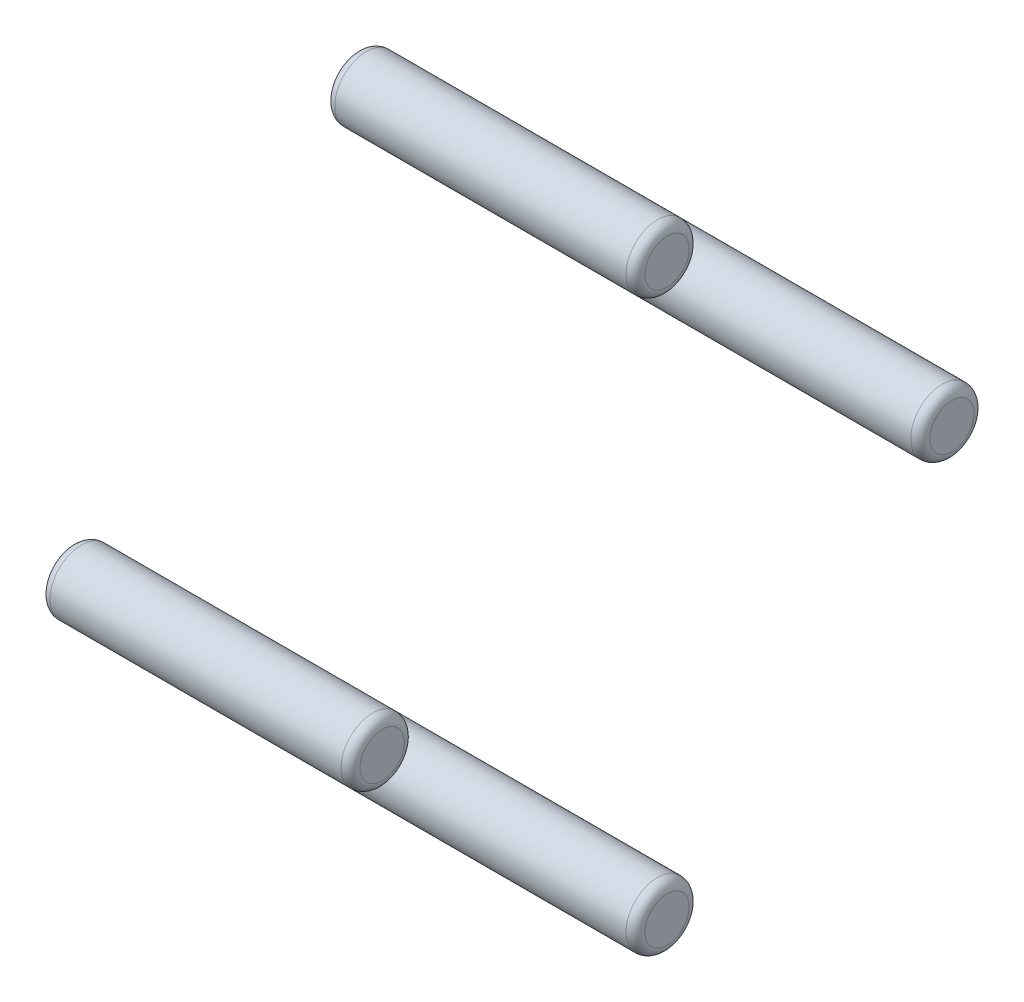
ISO-10303-21;
HEADER;
FILE_DESCRIPTION(('STEP AP214'),'2;1');
FILE_NAME('part.step','',(''),(''),'','','');
FILE_SCHEMA(('AUTOMOTIVE_DESIGN { 1 0 10303 214 1 1 1 1 }'));
ENDSEC;
DATA;
#1=APPLICATION_CONTEXT('core data for automotive mechanical design processes');
#2=APPLICATION_PROTOCOL_DEFINITION('international standard','automotive_design',2000,#1);
#3=PRODUCT_CONTEXT('',#1,'mechanical');
#4=PRODUCT('Part','Part','',(#3));
#5=PRODUCT_RELATED_PRODUCT_CATEGORY('part','',(#4));
#6=PRODUCT_DEFINITION_FORMATION('','',#4);
#7=PRODUCT_DEFINITION_CONTEXT('part definition',#1,'design');
#8=PRODUCT_DEFINITION('design','',#6,#7);
#9=PRODUCT_DEFINITION_SHAPE('','',#8);
#10=(LENGTH_UNIT() NAMED_UNIT(*) SI_UNIT(.MILLI.,.METRE.));
#11=(NAMED_UNIT(*) PLANE_ANGLE_UNIT() SI_UNIT($,.RADIAN.));
#12=(NAMED_UNIT(*) SI_UNIT($,.STERADIAN.) SOLID_ANGLE_UNIT());
#13=UNCERTAINTY_MEASURE_WITH_UNIT(LENGTH_MEASURE(1.E-05),#10,'distance_accuracy_value','');
#14=(GEOMETRIC_REPRESENTATION_CONTEXT(3) GLOBAL_UNCERTAINTY_ASSIGNED_CONTEXT((#13)) GLOBAL_UNIT_ASSIGNED_CONTEXT((#10,
#11,#12)) REPRESENTATION_CONTEXT('',''));
#15=CARTESIAN_POINT('',(0.,0.,0.));
#16=DIRECTION('',(0.,0.,1.));
#17=DIRECTION('',(1.,0.,0.));
#18=AXIS2_PLACEMENT_3D('',#15,#16,#17);
#19=CARTESIAN_POINT('',(1.59999999999999,0.,-9.35));
#20=DIRECTION('',(-1.,0.,0.));
#21=DIRECTION('',(0.,0.,1.));
#22=AXIS2_PLACEMENT_3D('',#19,#20,#21);
#23=PLANE('',#22);
#24=CARTESIAN_POINT('',(1.59999999999999,0.,-9.));
#25=DIRECTION('',(1.,0.,0.));
#26=DIRECTION('',(0.,0.,-1.));
#27=AXIS2_PLACEMENT_3D('',#24,#25,#26);
#28=CIRCLE('',#27,0.699999999999999);
#29=CARTESIAN_POINT('',(1.59999999999999,0.,-9.7));
#30=VERTEX_POINT('',#29);
#31=EDGE_CURVE('P0_E61',#30,#30,#28,.T.);
#32=ORIENTED_EDGE('',*,*,#31,.F.);
#33=EDGE_LOOP('',(#32));
#34=FACE_BOUND('',#33,.T.);
#35=ADVANCED_FACE('P0_F14',(#34),#23,.T.);
#36=CARTESIAN_POINT('',(11.4,0.,-9.35));
#37=DIRECTION('',(1.,0.,0.));
#38=DIRECTION('',(0.,0.,-1.));
#39=AXIS2_PLACEMENT_3D('',#36,#37,#38);
#40=PLANE('',#39);
#41=CARTESIAN_POINT('',(11.4,0.,-9.));
#42=DIRECTION('',(-1.,0.,0.));
#43=DIRECTION('',(0.,0.,-1.));
#44=AXIS2_PLACEMENT_3D('',#41,#42,#43);
#45=CIRCLE('',#44,0.699999999999999);
#46=CARTESIAN_POINT('',(11.4,0.,-9.7));
#47=VERTEX_POINT('',#46);
#48=EDGE_CURVE('P0_E29',#47,#47,#45,.T.);
#49=ORIENTED_EDGE('',*,*,#48,.F.);
#50=EDGE_LOOP('',(#49));
#51=FACE_BOUND('',#50,.T.);
#52=ADVANCED_FACE('P0_F74',(#51),#40,.T.);
#53=CARTESIAN_POINT('',(1.89999999999999,0.,-9.));
#54=DIRECTION('',(1.,0.,0.));
#55=DIRECTION('',(0.,-1.,0.));
#56=AXIS2_PLACEMENT_3D('',#53,#54,#55);
#57=TOROIDAL_SURFACE('',#56,0.7,0.3);
#58=ORIENTED_EDGE('',*,*,#31,.T.);
#59=EDGE_LOOP('',(#58));
#60=FACE_BOUND('',#59,.T.);
#61=CARTESIAN_POINT('',(1.89999999999999,0.,-9.));
#62=DIRECTION('',(1.,0.,0.));
#63=DIRECTION('',(0.,0.,-1.));
#64=AXIS2_PLACEMENT_3D('',#61,#62,#63);
#65=CIRCLE('',#64,1.);
#66=CARTESIAN_POINT('',(1.89999999999999,0.,-10.));
#67=VERTEX_POINT('',#66);
#68=EDGE_CURVE('P0_E24',#67,#67,#65,.T.);
#69=ORIENTED_EDGE('',*,*,#68,.F.);
#70=EDGE_LOOP('',(#69));
#71=FACE_BOUND('',#70,.T.);
#72=ADVANCED_FACE('P0_F42',(#60,#71),#57,.T.);
#73=CARTESIAN_POINT('',(11.1,0.,-9.));
#74=DIRECTION('',(1.,0.,0.));
#75=DIRECTION('',(0.,-1.,0.));
#76=AXIS2_PLACEMENT_3D('',#73,#74,#75);
#77=TOROIDAL_SURFACE('',#76,0.700000000000002,0.299999999999999);
#78=CARTESIAN_POINT('',(11.1,0.,-9.));
#79=DIRECTION('',(1.,0.,0.));
#80=DIRECTION('',(0.,0.,-1.));
#81=AXIS2_PLACEMENT_3D('',#78,#79,#80);
#82=CIRCLE('',#81,1.);
#83=CARTESIAN_POINT('',(11.1,0.,-10.));
#84=VERTEX_POINT('',#83);
#85=EDGE_CURVE('P0_E10',#84,#84,#82,.F.);
#86=ORIENTED_EDGE('',*,*,#85,.F.);
#87=EDGE_LOOP('',(#86));
#88=FACE_BOUND('',#87,.T.);
#89=ORIENTED_EDGE('',*,*,#48,.T.);
#90=EDGE_LOOP('',(#89));
#91=FACE_BOUND('',#90,.T.);
#92=ADVANCED_FACE('P0_F37',(#88,#91),#77,.T.);
#93=CARTESIAN_POINT('',(6.50000000000001,0.,-9.));
#94=DIRECTION('',(1.,0.,0.));
#95=DIRECTION('',(0.,0.,-1.));
#96=AXIS2_PLACEMENT_3D('',#93,#94,#95);
#97=CYLINDRICAL_SURFACE('',#96,1.);
#98=ORIENTED_EDGE('',*,*,#68,.T.);
#99=EDGE_LOOP('',(#98));
#100=FACE_BOUND('',#99,.T.);
#101=ORIENTED_EDGE('',*,*,#85,.T.);
#102=EDGE_LOOP('',(#101));
#103=FACE_BOUND('',#102,.T.);
#104=ADVANCED_FACE('P0_F41',(#100,#103),#97,.T.);
#105=CLOSED_SHELL('',(#35,#52,#72,#92,#104));
#106=MANIFOLD_SOLID_BREP('P0_B1',#105);
#107=CARTESIAN_POINT('',(1.59999999999999,9.35,0.));
#108=DIRECTION('',(-1.,0.,0.));
#109=DIRECTION('',(0.,-1.,0.));
#110=AXIS2_PLACEMENT_3D('',#107,#108,#109);
#111=PLANE('',#110);
#112=CARTESIAN_POINT('',(1.60000000000001,9.,0.));
#113=DIRECTION('',(1.,0.,0.));
#114=DIRECTION('',(0.,1.,0.));
#115=AXIS2_PLACEMENT_3D('',#112,#113,#114);
#116=CIRCLE('',#115,0.699999999999999);
#117=CARTESIAN_POINT('',(1.60000000000001,9.7,0.));
#118=VERTEX_POINT('',#117);
#119=EDGE_CURVE('P1_E61',#118,#118,#116,.T.);
#120=ORIENTED_EDGE('',*,*,#119,.F.);
#121=EDGE_LOOP('',(#120));
#122=FACE_BOUND('',#121,.T.);
#123=ADVANCED_FACE('P1_F14',(#122),#111,.T.);
#124=CARTESIAN_POINT('',(11.4,9.35,0.));
#125=DIRECTION('',(1.,0.,0.));
#126=DIRECTION('',(0.,0.,-1.));
#127=AXIS2_PLACEMENT_3D('',#124,#125,#126);
#128=PLANE('',#127);
#129=CARTESIAN_POINT('',(11.4,9.,0.));
#130=DIRECTION('',(-1.,0.,0.));
#131=DIRECTION('',(0.,1.,0.));
#132=AXIS2_PLACEMENT_3D('',#129,#130,#131);
#133=CIRCLE('',#132,0.699999999999999);
#134=CARTESIAN_POINT('',(11.4,9.7,0.));
#135=VERTEX_POINT('',#134);
#136=EDGE_CURVE('P1_E29',#135,#135,#133,.T.);
#137=ORIENTED_EDGE('',*,*,#136,.F.);
#138=EDGE_LOOP('',(#137));
#139=FACE_BOUND('',#138,.T.);
#140=ADVANCED_FACE('P1_F74',(#139),#128,.T.);
#141=CARTESIAN_POINT('',(1.90000000000001,9.,0.));
#142=DIRECTION('',(1.,0.,0.));
#143=DIRECTION('',(0.,0.,-1.));
#144=AXIS2_PLACEMENT_3D('',#141,#142,#143);
#145=TOROIDAL_SURFACE('',#144,0.7,0.3);
#146=ORIENTED_EDGE('',*,*,#119,.T.);
#147=EDGE_LOOP('',(#146));
#148=FACE_BOUND('',#147,.T.);
#149=CARTESIAN_POINT('',(1.90000000000001,9.,0.));
#150=DIRECTION('',(1.,0.,0.));
#151=DIRECTION('',(0.,0.,-1.));
#152=AXIS2_PLACEMENT_3D('',#149,#150,#151);
#153=CIRCLE('',#152,1.);
#154=CARTESIAN_POINT('',(1.90000000000001,9.,-1.));
#155=VERTEX_POINT('',#154);
#156=EDGE_CURVE('P1_E24',#155,#155,#153,.T.);
#157=ORIENTED_EDGE('',*,*,#156,.F.);
#158=EDGE_LOOP('',(#157));
#159=FACE_BOUND('',#158,.T.);
#160=ADVANCED_FACE('P1_F42',(#148,#159),#145,.T.);
#161=CARTESIAN_POINT('',(11.1,9.,0.));
#162=DIRECTION('',(1.,0.,0.));
#163=DIRECTION('',(0.,0.,-1.));
#164=AXIS2_PLACEMENT_3D('',#161,#162,#163);
#165=TOROIDAL_SURFACE('',#164,0.700000000000002,0.299999999999999);
#166=CARTESIAN_POINT('',(11.1,9.,0.));
#167=DIRECTION('',(1.,0.,0.));
#168=DIRECTION('',(0.,0.,-1.));
#169=AXIS2_PLACEMENT_3D('',#166,#167,#168);
#170=CIRCLE('',#169,1.);
#171=CARTESIAN_POINT('',(11.1,9.,-1.));
#172=VERTEX_POINT('',#171);
#173=EDGE_CURVE('P1_E10',#172,#172,#170,.F.);
#174=ORIENTED_EDGE('',*,*,#173,.F.);
#175=EDGE_LOOP('',(#174));
#176=FACE_BOUND('',#175,.T.);
#177=ORIENTED_EDGE('',*,*,#136,.T.);
#178=EDGE_LOOP('',(#177));
#179=FACE_BOUND('',#178,.T.);
#180=ADVANCED_FACE('P1_F37',(#176,#179),#165,.T.);
#181=CARTESIAN_POINT('',(6.50000000000001,9.,0.));
#182=DIRECTION('',(1.,0.,0.));
#183=DIRECTION('',(0.,0.,-1.));
#184=AXIS2_PLACEMENT_3D('',#181,#182,#183);
#185=CYLINDRICAL_SURFACE('',#184,1.);
#186=ORIENTED_EDGE('',*,*,#156,.T.);
#187=EDGE_LOOP('',(#186));
#188=FACE_BOUND('',#187,.T.);
#189=ORIENTED_EDGE('',*,*,#173,.T.);
#190=EDGE_LOOP('',(#189));
#191=FACE_BOUND('',#190,.T.);
#192=ADVANCED_FACE('P1_F41',(#188,#191),#185,.T.);
#193=CLOSED_SHELL('',(#123,#140,#160,#180,#192));
#194=MANIFOLD_SOLID_BREP('P1_B1',#193);
#195=CARTESIAN_POINT('',(1.59999999999999,-9.35,0.));
#196=DIRECTION('',(-1.,0.,0.));
#197=DIRECTION('',(0.,-1.,0.));
#198=AXIS2_PLACEMENT_3D('',#195,#196,#197);
#199=PLANE('',#198);
#200=CARTESIAN_POINT('',(1.59999999999999,-9.,0.));
#201=DIRECTION('',(1.,0.,0.));
#202=DIRECTION('',(0.,-1.,0.));
#203=AXIS2_PLACEMENT_3D('',#200,#201,#202);
#204=CIRCLE('',#203,0.699999999999999);
#205=CARTESIAN_POINT('',(1.59999999999999,-9.7,0.));
#206=VERTEX_POINT('',#205);
#207=EDGE_CURVE('P2_E61',#206,#206,#204,.T.);
#208=ORIENTED_EDGE('',*,*,#207,.F.);
#209=EDGE_LOOP('',(#208));
#210=FACE_BOUND('',#209,.T.);
#211=ADVANCED_FACE('P2_F14',(#210),#199,.T.);
#212=CARTESIAN_POINT('',(11.4,-9.35,0.));
#213=DIRECTION('',(1.,0.,0.));
#214=DIRECTION('',(0.,0.,-1.));
#215=AXIS2_PLACEMENT_3D('',#212,#213,#214);
#216=PLANE('',#215);
#217=CARTESIAN_POINT('',(11.4,-9.,0.));
#218=DIRECTION('',(-1.,0.,0.));
#219=DIRECTION('',(0.,-1.,0.));
#220=AXIS2_PLACEMENT_3D('',#217,#218,#219);
#221=CIRCLE('',#220,0.699999999999999);
#222=CARTESIAN_POINT('',(11.4,-9.7,0.));
#223=VERTEX_POINT('',#222);
#224=EDGE_CURVE('P2_E29',#223,#223,#221,.T.);
#225=ORIENTED_EDGE('',*,*,#224,.F.);
#226=EDGE_LOOP('',(#225));
#227=FACE_BOUND('',#226,.T.);
#228=ADVANCED_FACE('P2_F74',(#227),#216,.T.);
#229=CARTESIAN_POINT('',(1.89999999999999,-9.,0.));
#230=DIRECTION('',(1.,0.,0.));
#231=DIRECTION('',(0.,0.,1.));
#232=AXIS2_PLACEMENT_3D('',#229,#230,#231);
#233=TOROIDAL_SURFACE('',#232,0.7,0.3);
#234=ORIENTED_EDGE('',*,*,#207,.T.);
#235=EDGE_LOOP('',(#234));
#236=FACE_BOUND('',#235,.T.);
#237=CARTESIAN_POINT('',(1.89999999999999,-9.,0.));
#238=DIRECTION('',(1.,0.,0.));
#239=DIRECTION('',(0.,0.,-1.));
#240=AXIS2_PLACEMENT_3D('',#237,#238,#239);
#241=CIRCLE('',#240,1.);
#242=CARTESIAN_POINT('',(1.89999999999999,-9.,-1.));
#243=VERTEX_POINT('',#242);
#244=EDGE_CURVE('P2_E24',#243,#243,#241,.T.);
#245=ORIENTED_EDGE('',*,*,#244,.F.);
#246=EDGE_LOOP('',(#245));
#247=FACE_BOUND('',#246,.T.);
#248=ADVANCED_FACE('P2_F42',(#236,#247),#233,.T.);
#249=CARTESIAN_POINT('',(11.1,-9.,0.));
#250=DIRECTION('',(1.,0.,0.));
#251=DIRECTION('',(0.,0.,1.));
#252=AXIS2_PLACEMENT_3D('',#249,#250,#251);
#253=TOROIDAL_SURFACE('',#252,0.700000000000002,0.299999999999999);
#254=CARTESIAN_POINT('',(11.1,-9.,0.));
#255=DIRECTION('',(1.,0.,0.));
#256=DIRECTION('',(0.,0.,-1.));
#257=AXIS2_PLACEMENT_3D('',#254,#255,#256);
#258=CIRCLE('',#257,1.);
#259=CARTESIAN_POINT('',(11.1,-9.,-1.));
#260=VERTEX_POINT('',#259);
#261=EDGE_CURVE('P2_E10',#260,#260,#258,.F.);
#262=ORIENTED_EDGE('',*,*,#261,.F.);
#263=EDGE_LOOP('',(#262));
#264=FACE_BOUND('',#263,.T.);
#265=ORIENTED_EDGE('',*,*,#224,.T.);
#266=EDGE_LOOP('',(#265));
#267=FACE_BOUND('',#266,.T.);
#268=ADVANCED_FACE('P2_F37',(#264,#267),#253,.T.);
#269=CARTESIAN_POINT('',(6.50000000000001,-9.,0.));
#270=DIRECTION('',(1.,0.,0.));
#271=DIRECTION('',(0.,0.,-1.));
#272=AXIS2_PLACEMENT_3D('',#269,#270,#271);
#273=CYLINDRICAL_SURFACE('',#272,1.);
#274=ORIENTED_EDGE('',*,*,#244,.T.);
#275=EDGE_LOOP('',(#274));
#276=FACE_BOUND('',#275,.T.);
#277=ORIENTED_EDGE('',*,*,#261,.T.);
#278=EDGE_LOOP('',(#277));
#279=FACE_BOUND('',#278,.T.);
#280=ADVANCED_FACE('P2_F41',(#276,#279),#273,.T.);
#281=CLOSED_SHELL('',(#211,#228,#248,#268,#280));
#282=MANIFOLD_SOLID_BREP('P2_B1',#281);
#283=CARTESIAN_POINT('',(1.59999999999999,0.,9.35));
#284=DIRECTION('',(-1.,0.,0.));
#285=DIRECTION('',(0.,0.,1.));
#286=AXIS2_PLACEMENT_3D('',#283,#284,#285);
#287=PLANE('',#286);
#288=CARTESIAN_POINT('',(1.59999999999999,0.,9.));
#289=DIRECTION('',(1.,0.,0.));
#290=DIRECTION('',(0.,0.,1.));
#291=AXIS2_PLACEMENT_3D('',#288,#289,#290);
#292=CIRCLE('',#291,0.699999999999999);
#293=CARTESIAN_POINT('',(1.59999999999999,0.,9.7));
#294=VERTEX_POINT('',#293);
#295=EDGE_CURVE('P3_E61',#294,#294,#292,.T.);
#296=ORIENTED_EDGE('',*,*,#295,.F.);
#297=EDGE_LOOP('',(#296));
#298=FACE_BOUND('',#297,.T.);
#299=ADVANCED_FACE('P3_F14',(#298),#287,.T.);
#300=CARTESIAN_POINT('',(11.4,0.,9.35));
#301=DIRECTION('',(1.,0.,0.));
#302=DIRECTION('',(0.,0.,-1.));
#303=AXIS2_PLACEMENT_3D('',#300,#301,#302);
#304=PLANE('',#303);
#305=CARTESIAN_POINT('',(11.4,0.,9.));
#306=DIRECTION('',(-1.,0.,0.));
#307=DIRECTION('',(0.,0.,1.));
#308=AXIS2_PLACEMENT_3D('',#305,#306,#307);
#309=CIRCLE('',#308,0.699999999999999);
#310=CARTESIAN_POINT('',(11.4,0.,9.7));
#311=VERTEX_POINT('',#310);
#312=EDGE_CURVE('P3_E29',#311,#311,#309,.T.);
#313=ORIENTED_EDGE('',*,*,#312,.F.);
#314=EDGE_LOOP('',(#313));
#315=FACE_BOUND('',#314,.T.);
#316=ADVANCED_FACE('P3_F74',(#315),#304,.T.);
#317=CARTESIAN_POINT('',(1.89999999999999,0.,9.));
#318=DIRECTION('',(1.,0.,0.));
#319=DIRECTION('',(0.,1.,0.));
#320=AXIS2_PLACEMENT_3D('',#317,#318,#319);
#321=TOROIDAL_SURFACE('',#320,0.7,0.3);
#322=ORIENTED_EDGE('',*,*,#295,.T.);
#323=EDGE_LOOP('',(#322));
#324=FACE_BOUND('',#323,.T.);
#325=CARTESIAN_POINT('',(1.89999999999999,0.,9.));
#326=DIRECTION('',(1.,0.,0.));
#327=DIRECTION('',(0.,0.,-1.));
#328=AXIS2_PLACEMENT_3D('',#325,#326,#327);
#329=CIRCLE('',#328,1.);
#330=CARTESIAN_POINT('',(1.89999999999999,0.,8.));
#331=VERTEX_POINT('',#330);
#332=EDGE_CURVE('P3_E24',#331,#331,#329,.T.);
#333=ORIENTED_EDGE('',*,*,#332,.F.);
#334=EDGE_LOOP('',(#333));
#335=FACE_BOUND('',#334,.T.);
#336=ADVANCED_FACE('P3_F42',(#324,#335),#321,.T.);
#337=CARTESIAN_POINT('',(11.1,0.,9.));
#338=DIRECTION('',(1.,0.,0.));
#339=DIRECTION('',(0.,1.,0.));
#340=AXIS2_PLACEMENT_3D('',#337,#338,#339);
#341=TOROIDAL_SURFACE('',#340,0.700000000000002,0.299999999999999);
#342=CARTESIAN_POINT('',(11.1,0.,9.));
#343=DIRECTION('',(1.,0.,0.));
#344=DIRECTION('',(0.,0.,-1.));
#345=AXIS2_PLACEMENT_3D('',#342,#343,#344);
#346=CIRCLE('',#345,1.);
#347=CARTESIAN_POINT('',(11.1,0.,8.));
#348=VERTEX_POINT('',#347);
#349=EDGE_CURVE('P3_E10',#348,#348,#346,.F.);
#350=ORIENTED_EDGE('',*,*,#349,.F.);
#351=EDGE_LOOP('',(#350));
#352=FACE_BOUND('',#351,.T.);
#353=ORIENTED_EDGE('',*,*,#312,.T.);
#354=EDGE_LOOP('',(#353));
#355=FACE_BOUND('',#354,.T.);
#356=ADVANCED_FACE('P3_F37',(#352,#355),#341,.T.);
#357=CARTESIAN_POINT('',(6.50000000000001,0.,9.));
#358=DIRECTION('',(1.,0.,0.));
#359=DIRECTION('',(0.,0.,-1.));
#360=AXIS2_PLACEMENT_3D('',#357,#358,#359);
#361=CYLINDRICAL_SURFACE('',#360,1.);
#362=ORIENTED_EDGE('',*,*,#332,.T.);
#363=EDGE_LOOP('',(#362));
#364=FACE_BOUND('',#363,.T.);
#365=ORIENTED_EDGE('',*,*,#349,.T.);
#366=EDGE_LOOP('',(#365));
#367=FACE_BOUND('',#366,.T.);
#368=ADVANCED_FACE('P3_F41',(#364,#367),#361,.T.);
#369=CLOSED_SHELL('',(#299,#316,#336,#356,#368));
#370=MANIFOLD_SOLID_BREP('P3_B1',#369);
#371=ADVANCED_BREP_SHAPE_REPRESENTATION('',(#18,#106,#194,#282,#370),#14);
#372=SHAPE_DEFINITION_REPRESENTATION(#9,#371);
ENDSEC;
END-ISO-10303-21;
